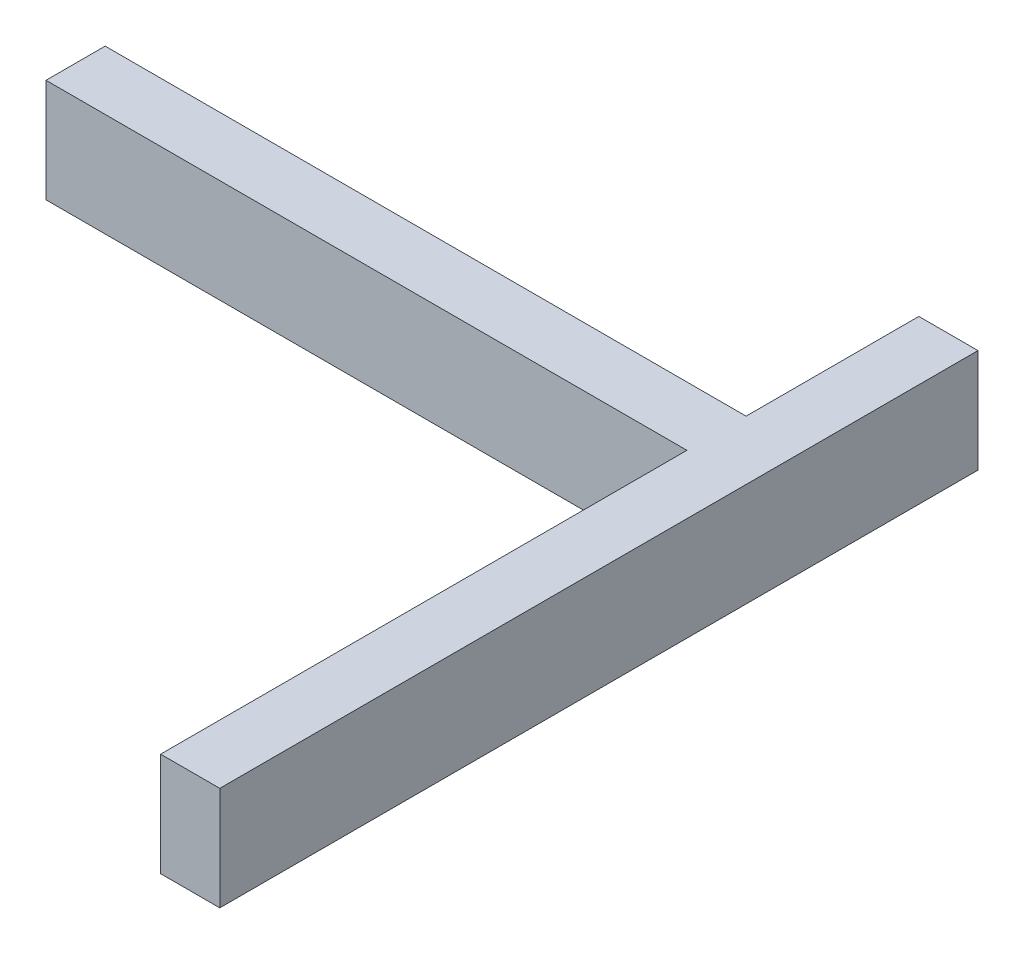
ISO-10303-21;
HEADER;
FILE_DESCRIPTION(('STEP AP214'),'2;1');
FILE_NAME('part.step','',(''),(''),'','','');
FILE_SCHEMA(('AUTOMOTIVE_DESIGN { 1 0 10303 214 1 1 1 1 }'));
ENDSEC;
DATA;
#1=APPLICATION_CONTEXT('core data for automotive mechanical design processes');
#2=APPLICATION_PROTOCOL_DEFINITION('international standard','automotive_design',2000,#1);
#3=PRODUCT_CONTEXT('',#1,'mechanical');
#4=PRODUCT('Part','Part','',(#3));
#5=PRODUCT_RELATED_PRODUCT_CATEGORY('part','',(#4));
#6=PRODUCT_DEFINITION_FORMATION('','',#4);
#7=PRODUCT_DEFINITION_CONTEXT('part definition',#1,'design');
#8=PRODUCT_DEFINITION('design','',#6,#7);
#9=PRODUCT_DEFINITION_SHAPE('','',#8);
#10=(LENGTH_UNIT() NAMED_UNIT(*) SI_UNIT(.MILLI.,.METRE.));
#11=(NAMED_UNIT(*) PLANE_ANGLE_UNIT() SI_UNIT($,.RADIAN.));
#12=(NAMED_UNIT(*) SI_UNIT($,.STERADIAN.) SOLID_ANGLE_UNIT());
#13=UNCERTAINTY_MEASURE_WITH_UNIT(LENGTH_MEASURE(1.E-05),#10,'distance_accuracy_value','');
#14=(GEOMETRIC_REPRESENTATION_CONTEXT(3) GLOBAL_UNCERTAINTY_ASSIGNED_CONTEXT((#13)) GLOBAL_UNIT_ASSIGNED_CONTEXT((#10,
#11,#12)) REPRESENTATION_CONTEXT('',''));
#15=CARTESIAN_POINT('',(0.,0.,0.));
#16=DIRECTION('',(0.,0.,1.));
#17=DIRECTION('',(1.,0.,0.));
#18=AXIS2_PLACEMENT_3D('',#15,#16,#17);
#19=CARTESIAN_POINT('',(-96.6685232784773,8.5,88.7386403343063));
#20=DIRECTION('',(0.,0.,1.));
#21=DIRECTION('',(1.,0.,0.));
#22=AXIS2_PLACEMENT_3D('',#19,#20,#21);
#23=PLANE('',#22);
#24=DIRECTION('',(-1.,0.,0.));
#25=VECTOR('',#24,1.);
#26=CARTESIAN_POINT('',(-96.6685232784773,1.5,88.7386403343063));
#27=LINE('',#26,#25);
#28=CARTESIAN_POINT('',(-92.6685232784773,1.5,88.7386403343063));
#29=VERTEX_POINT('',#28);
#30=CARTESIAN_POINT('',(-96.6685232784773,1.5,88.7386403343063));
#31=VERTEX_POINT('',#30);
#32=EDGE_CURVE('E164',#29,#31,#27,.T.);
#33=ORIENTED_EDGE('',*,*,#32,.T.);
#34=DIRECTION('',(0.,-1.,0.));
#35=VECTOR('',#34,1.);
#36=CARTESIAN_POINT('',(-96.6685232784773,8.5,88.7386403343063));
#37=LINE('',#36,#35);
#38=CARTESIAN_POINT('',(-96.6685232784773,8.5,88.7386403343063));
#39=VERTEX_POINT('',#38);
#40=EDGE_CURVE('E175',#39,#31,#37,.T.);
#41=ORIENTED_EDGE('',*,*,#40,.F.);
#42=DIRECTION('',(-1.,0.,0.));
#43=VECTOR('',#42,1.);
#44=CARTESIAN_POINT('',(-96.6685232784773,8.5,88.7386403343063));
#45=LINE('',#44,#43);
#46=CARTESIAN_POINT('',(-92.6685232784773,8.5,88.7386403343063));
#47=VERTEX_POINT('',#46);
#48=EDGE_CURVE('E158',#47,#39,#45,.T.);
#49=ORIENTED_EDGE('',*,*,#48,.F.);
#50=DIRECTION('',(0.,-1.,0.));
#51=VECTOR('',#50,1.);
#52=CARTESIAN_POINT('',(-92.6685232784773,8.5,88.7386403343063));
#53=LINE('',#52,#51);
#54=EDGE_CURVE('E130',#47,#29,#53,.T.);
#55=ORIENTED_EDGE('',*,*,#54,.T.);
#56=EDGE_LOOP('',(#33,#41,#49,#55));
#57=FACE_BOUND('',#56,.T.);
#58=ADVANCED_FACE('F45',(#57),#23,.F.);
#59=CARTESIAN_POINT('',(-96.6685232784773,8.5,100.418377476032));
#60=DIRECTION('',(1.,0.,0.));
#61=DIRECTION('',(0.,0.,-1.));
#62=AXIS2_PLACEMENT_3D('',#59,#60,#61);
#63=PLANE('',#62);
#64=DIRECTION('',(0.,0.,1.));
#65=VECTOR('',#64,1.);
#66=CARTESIAN_POINT('',(-96.6685232784773,1.5,100.418377476032));
#67=LINE('',#66,#65);
#68=CARTESIAN_POINT('',(-96.6685232784773,1.5,100.418377476032));
#69=VERTEX_POINT('',#68);
#70=EDGE_CURVE('E167',#31,#69,#67,.T.);
#71=ORIENTED_EDGE('',*,*,#70,.T.);
#72=DIRECTION('',(0.,-1.,0.));
#73=VECTOR('',#72,1.);
#74=CARTESIAN_POINT('',(-96.6685232784773,8.5,100.418377476032));
#75=LINE('',#74,#73);
#76=CARTESIAN_POINT('',(-96.6685232784773,8.5,100.418377476032));
#77=VERTEX_POINT('',#76);
#78=EDGE_CURVE('E172',#77,#69,#75,.T.);
#79=ORIENTED_EDGE('',*,*,#78,.F.);
#80=DIRECTION('',(0.,0.,1.));
#81=VECTOR('',#80,1.);
#82=CARTESIAN_POINT('',(-96.6685232784773,8.5,100.418377476032));
#83=LINE('',#82,#81);
#84=EDGE_CURVE('E160',#39,#77,#83,.T.);
#85=ORIENTED_EDGE('',*,*,#84,.F.);
#86=ORIENTED_EDGE('',*,*,#40,.T.);
#87=EDGE_LOOP('',(#71,#79,#85,#86));
#88=FACE_BOUND('',#87,.T.);
#89=ADVANCED_FACE('F189',(#88),#63,.F.);
#90=CARTESIAN_POINT('',(-140.,8.5,100.418377476032));
#91=DIRECTION('',(0.,0.,1.));
#92=DIRECTION('',(1.,0.,0.));
#93=AXIS2_PLACEMENT_3D('',#90,#91,#92);
#94=PLANE('',#93);
#95=DIRECTION('',(-1.,0.,0.));
#96=VECTOR('',#95,1.);
#97=CARTESIAN_POINT('',(-140.,1.5,100.418377476032));
#98=LINE('',#97,#96);
#99=CARTESIAN_POINT('',(-140.,1.5,100.418377476032));
#100=VERTEX_POINT('',#99);
#101=EDGE_CURVE('E151',#69,#100,#98,.T.);
#102=ORIENTED_EDGE('',*,*,#101,.T.);
#103=DIRECTION('',(0.,-1.,0.));
#104=VECTOR('',#103,1.);
#105=CARTESIAN_POINT('',(-140.,8.5,100.418377476032));
#106=LINE('',#105,#104);
#107=CARTESIAN_POINT('',(-140.,8.5,100.418377476032));
#108=VERTEX_POINT('',#107);
#109=EDGE_CURVE('E145',#108,#100,#106,.T.);
#110=ORIENTED_EDGE('',*,*,#109,.F.);
#111=DIRECTION('',(-1.,0.,0.));
#112=VECTOR('',#111,1.);
#113=CARTESIAN_POINT('',(-140.,8.5,100.418377476032));
#114=LINE('',#113,#112);
#115=EDGE_CURVE('E61',#77,#108,#114,.T.);
#116=ORIENTED_EDGE('',*,*,#115,.F.);
#117=ORIENTED_EDGE('',*,*,#78,.T.);
#118=EDGE_LOOP('',(#102,#110,#116,#117));
#119=FACE_BOUND('',#118,.T.);
#120=ADVANCED_FACE('F191',(#119),#94,.F.);
#121=CARTESIAN_POINT('',(-96.6685232784773,8.5,104.418377476032));
#122=DIRECTION('',(0.,0.,-1.));
#123=DIRECTION('',(-1.,0.,0.));
#124=AXIS2_PLACEMENT_3D('',#121,#122,#123);
#125=PLANE('',#124);
#126=DIRECTION('',(1.,0.,0.));
#127=VECTOR('',#126,1.);
#128=CARTESIAN_POINT('',(-96.6685232784773,1.5,104.418377476032));
#129=LINE('',#128,#127);
#130=CARTESIAN_POINT('',(-140.,1.5,104.418377476032));
#131=VERTEX_POINT('',#130);
#132=CARTESIAN_POINT('',(-96.6685232784773,1.5,104.418377476032));
#133=VERTEX_POINT('',#132);
#134=EDGE_CURVE('E124',#131,#133,#129,.T.);
#135=ORIENTED_EDGE('',*,*,#134,.T.);
#136=DIRECTION('',(0.,-1.,0.));
#137=VECTOR('',#136,1.);
#138=CARTESIAN_POINT('',(-96.6685232784773,8.5,104.418377476032));
#139=LINE('',#138,#137);
#140=CARTESIAN_POINT('',(-96.6685232784773,8.5,104.418377476032));
#141=VERTEX_POINT('',#140);
#142=EDGE_CURVE('E123',#141,#133,#139,.T.);
#143=ORIENTED_EDGE('',*,*,#142,.F.);
#144=DIRECTION('',(1.,0.,0.));
#145=VECTOR('',#144,1.);
#146=CARTESIAN_POINT('',(-96.6685232784773,8.5,104.418377476032));
#147=LINE('',#146,#145);
#148=CARTESIAN_POINT('',(-140.,8.5,104.418377476032));
#149=VERTEX_POINT('',#148);
#150=EDGE_CURVE('E137',#149,#141,#147,.T.);
#151=ORIENTED_EDGE('',*,*,#150,.F.);
#152=DIRECTION('',(0.,-1.,0.));
#153=VECTOR('',#152,1.);
#154=CARTESIAN_POINT('',(-140.,8.5,104.418377476032));
#155=LINE('',#154,#153);
#156=EDGE_CURVE('E54',#149,#131,#155,.T.);
#157=ORIENTED_EDGE('',*,*,#156,.T.);
#158=EDGE_LOOP('',(#135,#143,#151,#157));
#159=FACE_BOUND('',#158,.T.);
#160=ADVANCED_FACE('F136',(#159),#125,.F.);
#161=CARTESIAN_POINT('',(-140.,1.5,140.));
#162=DIRECTION('',(1.,0.,0.));
#163=DIRECTION('',(0.,0.,-1.));
#164=AXIS2_PLACEMENT_3D('',#161,#162,#163);
#165=PLANE('',#164);
#166=ORIENTED_EDGE('',*,*,#109,.T.);
#167=DIRECTION('',(0.,0.,1.));
#168=VECTOR('',#167,1.);
#169=CARTESIAN_POINT('',(-140.,1.5,140.));
#170=LINE('',#169,#168);
#171=EDGE_CURVE('E144',#100,#131,#170,.T.);
#172=ORIENTED_EDGE('',*,*,#171,.T.);
#173=ORIENTED_EDGE('',*,*,#156,.F.);
#174=DIRECTION('',(0.,0.,1.));
#175=VECTOR('',#174,1.);
#176=CARTESIAN_POINT('',(-140.,8.5,104.418377476032));
#177=LINE('',#176,#175);
#178=EDGE_CURVE('E143',#108,#149,#177,.T.);
#179=ORIENTED_EDGE('',*,*,#178,.F.);
#180=EDGE_LOOP('',(#166,#172,#173,#179));
#181=FACE_BOUND('',#180,.T.);
#182=ADVANCED_FACE('F142',(#181),#165,.F.);
#183=CARTESIAN_POINT('',(-96.6685232784773,8.5,140.));
#184=DIRECTION('',(1.,0.,0.));
#185=DIRECTION('',(0.,0.,-1.));
#186=AXIS2_PLACEMENT_3D('',#183,#184,#185);
#187=PLANE('',#186);
#188=DIRECTION('',(0.,0.,1.));
#189=VECTOR('',#188,1.);
#190=CARTESIAN_POINT('',(-96.6685232784773,1.5,140.));
#191=LINE('',#190,#189);
#192=CARTESIAN_POINT('',(-96.6685232784773,1.5,140.));
#193=VERTEX_POINT('',#192);
#194=EDGE_CURVE('E107',#133,#193,#191,.T.);
#195=ORIENTED_EDGE('',*,*,#194,.T.);
#196=DIRECTION('',(0.,-1.,0.));
#197=VECTOR('',#196,1.);
#198=CARTESIAN_POINT('',(-96.6685232784773,8.5,140.));
#199=LINE('',#198,#197);
#200=CARTESIAN_POINT('',(-96.6685232784773,8.5,140.));
#201=VERTEX_POINT('',#200);
#202=EDGE_CURVE('E120',#201,#193,#199,.T.);
#203=ORIENTED_EDGE('',*,*,#202,.F.);
#204=DIRECTION('',(0.,0.,1.));
#205=VECTOR('',#204,1.);
#206=CARTESIAN_POINT('',(-96.6685232784773,8.5,140.));
#207=LINE('',#206,#205);
#208=EDGE_CURVE('E153',#141,#201,#207,.T.);
#209=ORIENTED_EDGE('',*,*,#208,.F.);
#210=ORIENTED_EDGE('',*,*,#142,.T.);
#211=EDGE_LOOP('',(#195,#203,#209,#210));
#212=FACE_BOUND('',#211,.T.);
#213=ADVANCED_FACE('F118',(#212),#187,.F.);
#214=CARTESIAN_POINT('',(0.,8.5,0.));
#215=DIRECTION('',(0.,-1.,0.));
#216=DIRECTION('',(0.,0.,-1.));
#217=AXIS2_PLACEMENT_3D('',#214,#215,#216);
#218=PLANE('',#217);
#219=ORIENTED_EDGE('',*,*,#178,.T.);
#220=ORIENTED_EDGE('',*,*,#150,.T.);
#221=ORIENTED_EDGE('',*,*,#208,.T.);
#222=DIRECTION('',(1.,0.,0.));
#223=VECTOR('',#222,1.);
#224=CARTESIAN_POINT('',(-92.6685232784773,8.5,140.));
#225=LINE('',#224,#223);
#226=CARTESIAN_POINT('',(-92.6685232784773,8.5,140.));
#227=VERTEX_POINT('',#226);
#228=EDGE_CURVE('E126',#201,#227,#225,.T.);
#229=ORIENTED_EDGE('',*,*,#228,.T.);
#230=DIRECTION('',(0.,0.,-1.));
#231=VECTOR('',#230,1.);
#232=CARTESIAN_POINT('',(-92.6685232784773,8.5,88.7386403343063));
#233=LINE('',#232,#231);
#234=EDGE_CURVE('E156',#227,#47,#233,.T.);
#235=ORIENTED_EDGE('',*,*,#234,.T.);
#236=ORIENTED_EDGE('',*,*,#48,.T.);
#237=ORIENTED_EDGE('',*,*,#84,.T.);
#238=ORIENTED_EDGE('',*,*,#115,.T.);
#239=EDGE_LOOP('',(#219,#220,#221,#229,#235,#236,#237,#238));
#240=FACE_BOUND('',#239,.T.);
#241=ADVANCED_FACE('F185',(#240),#218,.F.);
#242=CARTESIAN_POINT('',(-92.6685232784773,8.5,88.7386403343063));
#243=DIRECTION('',(-1.,0.,0.));
#244=DIRECTION('',(0.,0.,1.));
#245=AXIS2_PLACEMENT_3D('',#242,#243,#244);
#246=PLANE('',#245);
#247=DIRECTION('',(0.,0.,-1.));
#248=VECTOR('',#247,1.);
#249=CARTESIAN_POINT('',(-92.6685232784773,1.5,88.7386403343063));
#250=LINE('',#249,#248);
#251=CARTESIAN_POINT('',(-92.6685232784773,1.5,140.));
#252=VERTEX_POINT('',#251);
#253=EDGE_CURVE('E110',#252,#29,#250,.T.);
#254=ORIENTED_EDGE('',*,*,#253,.T.);
#255=ORIENTED_EDGE('',*,*,#54,.F.);
#256=ORIENTED_EDGE('',*,*,#234,.F.);
#257=DIRECTION('',(0.,-1.,0.));
#258=VECTOR('',#257,1.);
#259=CARTESIAN_POINT('',(-92.6685232784773,8.5,140.));
#260=LINE('',#259,#258);
#261=EDGE_CURVE('E127',#227,#252,#260,.T.);
#262=ORIENTED_EDGE('',*,*,#261,.T.);
#263=EDGE_LOOP('',(#254,#255,#256,#262));
#264=FACE_BOUND('',#263,.T.);
#265=ADVANCED_FACE('F184',(#264),#246,.F.);
#266=CARTESIAN_POINT('',(140.,1.5,140.));
#267=DIRECTION('',(0.,0.,-1.));
#268=DIRECTION('',(-1.,0.,0.));
#269=AXIS2_PLACEMENT_3D('',#266,#267,#268);
#270=PLANE('',#269);
#271=ORIENTED_EDGE('',*,*,#202,.T.);
#272=DIRECTION('',(1.,0.,0.));
#273=VECTOR('',#272,1.);
#274=CARTESIAN_POINT('',(140.,1.5,140.));
#275=LINE('',#274,#273);
#276=EDGE_CURVE('E11',#193,#252,#275,.T.);
#277=ORIENTED_EDGE('',*,*,#276,.T.);
#278=ORIENTED_EDGE('',*,*,#261,.F.);
#279=ORIENTED_EDGE('',*,*,#228,.F.);
#280=EDGE_LOOP('',(#271,#277,#278,#279));
#281=FACE_BOUND('',#280,.T.);
#282=ADVANCED_FACE('F47',(#281),#270,.F.);
#283=CARTESIAN_POINT('',(-148.255747001362,1.5,140.));
#284=DIRECTION('',(0.,1.,0.));
#285=DIRECTION('',(0.,0.,1.));
#286=AXIS2_PLACEMENT_3D('',#283,#284,#285);
#287=PLANE('',#286);
#288=ORIENTED_EDGE('',*,*,#134,.F.);
#289=ORIENTED_EDGE('',*,*,#171,.F.);
#290=ORIENTED_EDGE('',*,*,#101,.F.);
#291=ORIENTED_EDGE('',*,*,#70,.F.);
#292=ORIENTED_EDGE('',*,*,#32,.F.);
#293=ORIENTED_EDGE('',*,*,#253,.F.);
#294=ORIENTED_EDGE('',*,*,#276,.F.);
#295=ORIENTED_EDGE('',*,*,#194,.F.);
#296=EDGE_LOOP('',(#288,#289,#290,#291,#292,#293,#294,#295));
#297=FACE_BOUND('',#296,.T.);
#298=ADVANCED_FACE('F106',(#297),#287,.F.);
#299=CLOSED_SHELL('',(#58,#89,#120,#160,#182,#213,#241,#265,#282,#298));
#300=MANIFOLD_SOLID_BREP('B2',#299);
#301=ADVANCED_BREP_SHAPE_REPRESENTATION('',(#18,#300),#14);
#302=SHAPE_DEFINITION_REPRESENTATION(#9,#301);
ENDSEC;
END-ISO-10303-21;
